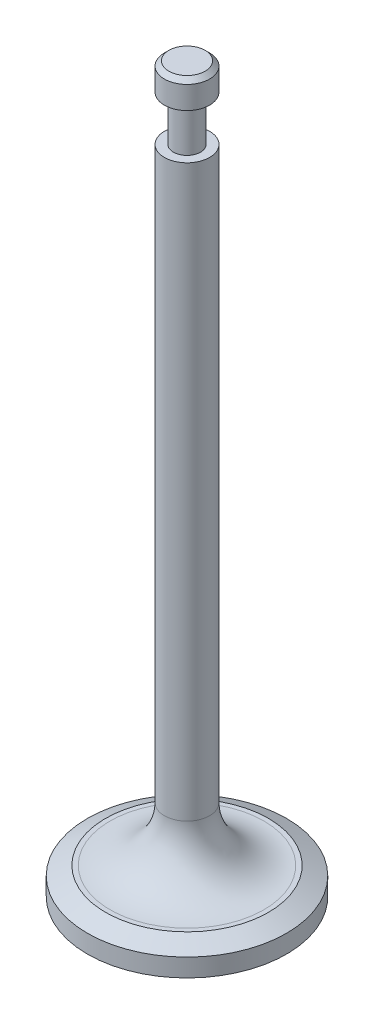
ISO-10303-21;
HEADER;
FILE_DESCRIPTION(('STEP AP214'),'2;1');
FILE_NAME('part.step','',(''),(''),'','','');
FILE_SCHEMA(('AUTOMOTIVE_DESIGN { 1 0 10303 214 1 1 1 1 }'));
ENDSEC;
DATA;
#1=APPLICATION_CONTEXT('core data for automotive mechanical design processes');
#2=APPLICATION_PROTOCOL_DEFINITION('international standard','automotive_design',2000,#1);
#3=PRODUCT_CONTEXT('',#1,'mechanical');
#4=PRODUCT('Part','Part','',(#3));
#5=PRODUCT_RELATED_PRODUCT_CATEGORY('part','',(#4));
#6=PRODUCT_DEFINITION_FORMATION('','',#4);
#7=PRODUCT_DEFINITION_CONTEXT('part definition',#1,'design');
#8=PRODUCT_DEFINITION('design','',#6,#7);
#9=PRODUCT_DEFINITION_SHAPE('','',#8);
#10=(LENGTH_UNIT() NAMED_UNIT(*) SI_UNIT(.MILLI.,.METRE.));
#11=(NAMED_UNIT(*) PLANE_ANGLE_UNIT() SI_UNIT($,.RADIAN.));
#12=(NAMED_UNIT(*) SI_UNIT($,.STERADIAN.) SOLID_ANGLE_UNIT());
#13=UNCERTAINTY_MEASURE_WITH_UNIT(LENGTH_MEASURE(1.E-05),#10,'distance_accuracy_value','');
#14=(GEOMETRIC_REPRESENTATION_CONTEXT(3) GLOBAL_UNCERTAINTY_ASSIGNED_CONTEXT((#13)) GLOBAL_UNIT_ASSIGNED_CONTEXT((#10,
#11,#12)) REPRESENTATION_CONTEXT('',''));
#15=CARTESIAN_POINT('',(0.,0.,0.));
#16=DIRECTION('',(0.,0.,1.));
#17=DIRECTION('',(1.,0.,0.));
#18=AXIS2_PLACEMENT_3D('',#15,#16,#17);
#19=CARTESIAN_POINT('',(0.,0.,-2.50000000000002));
#20=DIRECTION('',(0.,-1.,0.));
#21=DIRECTION('',(0.,0.,-1.));
#22=AXIS2_PLACEMENT_3D('',#19,#20,#21);
#23=PLANE('',#22);
#24=CARTESIAN_POINT('',(0.,0.,0.));
#25=DIRECTION('',(0.,-1.,0.));
#26=DIRECTION('',(0.,0.,-1.));
#27=AXIS2_PLACEMENT_3D('',#24,#25,#26);
#28=CIRCLE('',#27,2.00000000000002);
#29=CARTESIAN_POINT('',(0.,0.,-2.00000000000002));
#30=VERTEX_POINT('',#29);
#31=EDGE_CURVE('E49',#30,#30,#28,.F.);
#32=ORIENTED_EDGE('',*,*,#31,.T.);
#33=EDGE_LOOP('',(#32));
#34=FACE_BOUND('',#33,.T.);
#35=ADVANCED_FACE('F41',(#34),#23,.F.);
#36=CARTESIAN_POINT('',(0.,-80.,0.));
#37=DIRECTION('',(0.,1.,0.));
#38=DIRECTION('',(0.,0.,1.));
#39=AXIS2_PLACEMENT_3D('',#36,#37,#38);
#40=PLANE('',#39);
#41=CARTESIAN_POINT('',(0.,-80.,0.));
#42=DIRECTION('',(0.,1.,0.));
#43=DIRECTION('',(0.,0.,1.));
#44=AXIS2_PLACEMENT_3D('',#41,#42,#43);
#45=CIRCLE('',#44,11.);
#46=CARTESIAN_POINT('',(0.,-80.,11.));
#47=VERTEX_POINT('',#46);
#48=EDGE_CURVE('E68',#47,#47,#45,.T.);
#49=ORIENTED_EDGE('',*,*,#48,.F.);
#50=EDGE_LOOP('',(#49));
#51=FACE_BOUND('',#50,.T.);
#52=ADVANCED_FACE('F117',(#51),#40,.F.);
#53=CARTESIAN_POINT('',(0.,0.,0.));
#54=DIRECTION('',(0.,1.,0.));
#55=DIRECTION('',(0.,0.,1.));
#56=AXIS2_PLACEMENT_3D('',#53,#54,#55);
#57=CYLINDRICAL_SURFACE('',#56,11.);
#58=CARTESIAN_POINT('',(0.,-78.,0.));
#59=DIRECTION('',(0.,-1.,0.));
#60=DIRECTION('',(0.,0.,-1.));
#61=AXIS2_PLACEMENT_3D('',#58,#59,#60);
#62=CIRCLE('',#61,11.);
#63=CARTESIAN_POINT('',(0.,-78.,-11.));
#64=VERTEX_POINT('',#63);
#65=EDGE_CURVE('E53',#64,#64,#62,.T.);
#66=ORIENTED_EDGE('',*,*,#65,.T.);
#67=EDGE_LOOP('',(#66));
#68=FACE_BOUND('',#67,.T.);
#69=ORIENTED_EDGE('',*,*,#48,.T.);
#70=EDGE_LOOP('',(#69));
#71=FACE_BOUND('',#70,.T.);
#72=ADVANCED_FACE('F113',(#68,#71),#57,.T.);
#73=CARTESIAN_POINT('',(0.,-77.,-11.));
#74=DIRECTION('',(0.,-1.,0.));
#75=DIRECTION('',(0.,0.,-1.));
#76=AXIS2_PLACEMENT_3D('',#73,#74,#75);
#77=PLANE('',#76);
#78=CARTESIAN_POINT('',(0.,-77.,0.));
#79=DIRECTION('',(0.,-1.,0.));
#80=DIRECTION('',(0.,0.,-1.));
#81=AXIS2_PLACEMENT_3D('',#78,#79,#80);
#82=CIRCLE('',#81,8.99999999999997);
#83=CARTESIAN_POINT('',(0.,-77.,-8.99999999999997));
#84=VERTEX_POINT('',#83);
#85=EDGE_CURVE('E57',#84,#84,#82,.F.);
#86=ORIENTED_EDGE('',*,*,#85,.T.);
#87=EDGE_LOOP('',(#86));
#88=FACE_BOUND('',#87,.T.);
#89=CARTESIAN_POINT('',(0.,-77.,0.));
#90=DIRECTION('',(0.,-1.,0.));
#91=DIRECTION('',(0.,0.,-1.));
#92=AXIS2_PLACEMENT_3D('',#89,#90,#91);
#93=CIRCLE('',#92,8.50000000000001);
#94=CARTESIAN_POINT('',(0.,-77.,-8.50000000000001));
#95=VERTEX_POINT('',#94);
#96=EDGE_CURVE('E62',#95,#95,#93,.T.);
#97=ORIENTED_EDGE('',*,*,#96,.T.);
#98=EDGE_LOOP('',(#97));
#99=FACE_BOUND('',#98,.T.);
#100=ADVANCED_FACE('F106',(#88,#99),#77,.F.);
#101=CARTESIAN_POINT('',(0.,0.,0.));
#102=DIRECTION('',(0.,1.,0.));
#103=DIRECTION('',(0.,0.,1.));
#104=AXIS2_PLACEMENT_3D('',#101,#102,#103);
#105=CYLINDRICAL_SURFACE('',#104,2.50000000000001);
#106=CARTESIAN_POINT('',(0.,-71.,0.));
#107=DIRECTION('',(0.,-1.,0.));
#108=DIRECTION('',(0.,0.,-1.));
#109=AXIS2_PLACEMENT_3D('',#106,#107,#108);
#110=CIRCLE('',#109,2.50000000000001);
#111=CARTESIAN_POINT('',(0.,-71.,-2.50000000000001));
#112=VERTEX_POINT('',#111);
#113=EDGE_CURVE('E65',#112,#112,#110,.F.);
#114=ORIENTED_EDGE('',*,*,#113,.T.);
#115=EDGE_LOOP('',(#114));
#116=FACE_BOUND('',#115,.T.);
#117=CARTESIAN_POINT('',(0.,-8.,0.));
#118=DIRECTION('',(0.,1.,0.));
#119=DIRECTION('',(0.,0.,1.));
#120=AXIS2_PLACEMENT_3D('',#117,#118,#119);
#121=CIRCLE('',#120,2.50000000000001);
#122=CARTESIAN_POINT('',(0.,-8.,2.50000000000001));
#123=VERTEX_POINT('',#122);
#124=EDGE_CURVE('E71',#123,#123,#121,.T.);
#125=ORIENTED_EDGE('',*,*,#124,.F.);
#126=EDGE_LOOP('',(#125));
#127=FACE_BOUND('',#126,.T.);
#128=ADVANCED_FACE('F101',(#116,#127),#105,.T.);
#129=CARTESIAN_POINT('',(0.,-8.,-2.50000000000001));
#130=DIRECTION('',(0.,-1.,0.));
#131=DIRECTION('',(0.,0.,-1.));
#132=AXIS2_PLACEMENT_3D('',#129,#130,#131);
#133=PLANE('',#132);
#134=CARTESIAN_POINT('',(0.,-8.,0.));
#135=DIRECTION('',(0.,1.,0.));
#136=DIRECTION('',(0.,0.,1.));
#137=AXIS2_PLACEMENT_3D('',#134,#135,#136);
#138=CIRCLE('',#137,1.50000000000002);
#139=CARTESIAN_POINT('',(0.,-8.,1.50000000000002));
#140=VERTEX_POINT('',#139);
#141=EDGE_CURVE('E74',#140,#140,#138,.T.);
#142=ORIENTED_EDGE('',*,*,#141,.F.);
#143=EDGE_LOOP('',(#142));
#144=FACE_BOUND('',#143,.T.);
#145=ORIENTED_EDGE('',*,*,#124,.T.);
#146=EDGE_LOOP('',(#145));
#147=FACE_BOUND('',#146,.T.);
#148=ADVANCED_FACE('F95',(#144,#147),#133,.F.);
#149=CARTESIAN_POINT('',(0.,0.,0.));
#150=DIRECTION('',(0.,1.,0.));
#151=DIRECTION('',(0.,0.,1.));
#152=AXIS2_PLACEMENT_3D('',#149,#150,#151);
#153=CYLINDRICAL_SURFACE('',#152,1.50000000000002);
#154=CARTESIAN_POINT('',(0.,-3.,0.));
#155=DIRECTION('',(0.,1.,0.));
#156=DIRECTION('',(0.,0.,1.));
#157=AXIS2_PLACEMENT_3D('',#154,#155,#156);
#158=CIRCLE('',#157,1.50000000000002);
#159=CARTESIAN_POINT('',(0.,-3.,1.50000000000002));
#160=VERTEX_POINT('',#159);
#161=EDGE_CURVE('E77',#160,#160,#158,.T.);
#162=ORIENTED_EDGE('',*,*,#161,.F.);
#163=EDGE_LOOP('',(#162));
#164=FACE_BOUND('',#163,.T.);
#165=ORIENTED_EDGE('',*,*,#141,.T.);
#166=EDGE_LOOP('',(#165));
#167=FACE_BOUND('',#166,.T.);
#168=ADVANCED_FACE('F89',(#164,#167),#153,.T.);
#169=CARTESIAN_POINT('',(0.,-3.,-1.50000000000002));
#170=DIRECTION('',(0.,1.,0.));
#171=DIRECTION('',(0.,0.,1.));
#172=AXIS2_PLACEMENT_3D('',#169,#170,#171);
#173=PLANE('',#172);
#174=CARTESIAN_POINT('',(0.,-3.,0.));
#175=DIRECTION('',(0.,1.,0.));
#176=DIRECTION('',(0.,0.,1.));
#177=AXIS2_PLACEMENT_3D('',#174,#175,#176);
#178=CIRCLE('',#177,2.50000000000002);
#179=CARTESIAN_POINT('',(0.,-3.,2.50000000000002));
#180=VERTEX_POINT('',#179);
#181=EDGE_CURVE('E80',#180,#180,#178,.T.);
#182=ORIENTED_EDGE('',*,*,#181,.F.);
#183=EDGE_LOOP('',(#182));
#184=FACE_BOUND('',#183,.T.);
#185=ORIENTED_EDGE('',*,*,#161,.T.);
#186=EDGE_LOOP('',(#185));
#187=FACE_BOUND('',#186,.T.);
#188=ADVANCED_FACE('F86',(#184,#187),#173,.F.);
#189=CARTESIAN_POINT('',(0.,0.,0.));
#190=DIRECTION('',(0.,1.,0.));
#191=DIRECTION('',(0.,0.,1.));
#192=AXIS2_PLACEMENT_3D('',#189,#190,#191);
#193=CYLINDRICAL_SURFACE('',#192,2.50000000000002);
#194=CARTESIAN_POINT('',(0.,-0.500000000000004,0.));
#195=DIRECTION('',(0.,-1.,0.));
#196=DIRECTION('',(0.,0.,-1.));
#197=AXIS2_PLACEMENT_3D('',#194,#195,#196);
#198=CIRCLE('',#197,2.50000000000002);
#199=CARTESIAN_POINT('',(0.,-0.500000000000004,-2.50000000000002));
#200=VERTEX_POINT('',#199);
#201=EDGE_CURVE('E10',#200,#200,#198,.T.);
#202=ORIENTED_EDGE('',*,*,#201,.T.);
#203=EDGE_LOOP('',(#202));
#204=FACE_BOUND('',#203,.T.);
#205=ORIENTED_EDGE('',*,*,#181,.T.);
#206=EDGE_LOOP('',(#205));
#207=FACE_BOUND('',#206,.T.);
#208=ADVANCED_FACE('F84',(#204,#207),#193,.T.);
#209=CARTESIAN_POINT('',(0.,-71.,0.));
#210=DIRECTION('',(0.,-1.,0.));
#211=DIRECTION('',(0.,0.,-1.));
#212=AXIS2_PLACEMENT_3D('',#209,#210,#211);
#213=TOROIDAL_SURFACE('',#212,8.50000000000001,6.);
#214=ORIENTED_EDGE('',*,*,#96,.F.);
#215=EDGE_LOOP('',(#214));
#216=FACE_BOUND('',#215,.T.);
#217=ORIENTED_EDGE('',*,*,#113,.F.);
#218=EDGE_LOOP('',(#217));
#219=FACE_BOUND('',#218,.T.);
#220=ADVANCED_FACE('F128',(#216,#219),#213,.F.);
#221=CARTESIAN_POINT('',(0.,-77.,0.));
#222=DIRECTION('',(0.,-1.,0.));
#223=DIRECTION('',(0.,0.,-1.));
#224=AXIS2_PLACEMENT_3D('',#221,#222,#223);
#225=CONICAL_SURFACE('',#224,8.99999999999997,1.10714871779409);
#226=ORIENTED_EDGE('',*,*,#65,.F.);
#227=EDGE_LOOP('',(#226));
#228=FACE_BOUND('',#227,.T.);
#229=ORIENTED_EDGE('',*,*,#85,.F.);
#230=EDGE_LOOP('',(#229));
#231=FACE_BOUND('',#230,.T.);
#232=ADVANCED_FACE('F129',(#228,#231),#225,.T.);
#233=CARTESIAN_POINT('',(0.,0.,0.));
#234=DIRECTION('',(0.,-1.,0.));
#235=DIRECTION('',(0.,0.,-1.));
#236=AXIS2_PLACEMENT_3D('',#233,#234,#235);
#237=CONICAL_SURFACE('',#236,2.00000000000002,0.78539816339744);
#238=ORIENTED_EDGE('',*,*,#201,.F.);
#239=EDGE_LOOP('',(#238));
#240=FACE_BOUND('',#239,.T.);
#241=ORIENTED_EDGE('',*,*,#31,.F.);
#242=EDGE_LOOP('',(#241));
#243=FACE_BOUND('',#242,.T.);
#244=ADVANCED_FACE('F44',(#240,#243),#237,.T.);
#245=CLOSED_SHELL('',(#35,#52,#72,#100,#128,#148,#168,#188,#208,#220,#232,#244));
#246=MANIFOLD_SOLID_BREP('B2',#245);
#247=ADVANCED_BREP_SHAPE_REPRESENTATION('',(#18,#246),#14);
#248=SHAPE_DEFINITION_REPRESENTATION(#9,#247);
ENDSEC;
END-ISO-10303-21;
